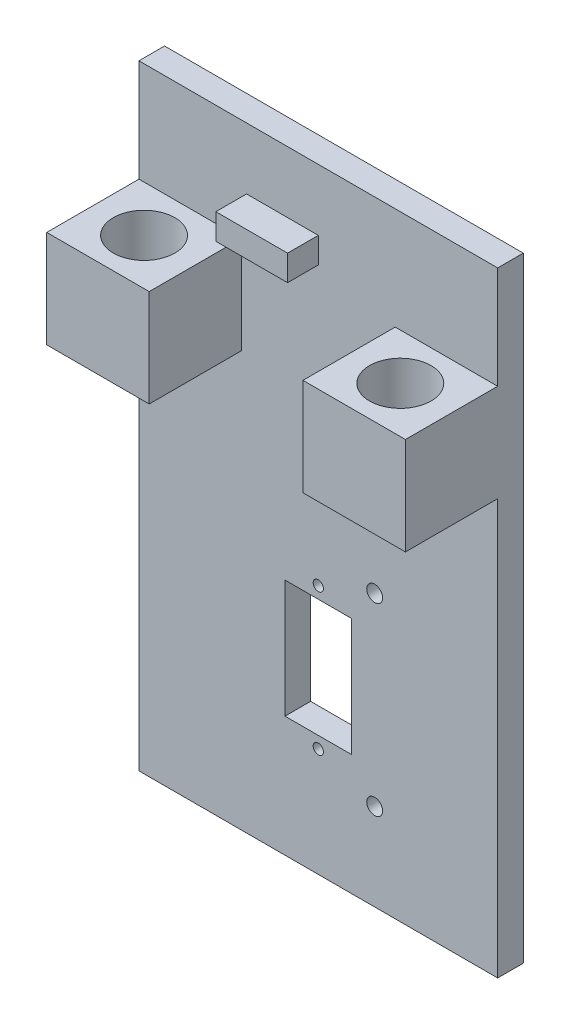
ISO-10303-21;
HEADER;
FILE_DESCRIPTION(('STEP AP214'),'2;1');
FILE_NAME('part.step','',(''),(''),'','','');
FILE_SCHEMA(('AUTOMOTIVE_DESIGN { 1 0 10303 214 1 1 1 1 }'));
ENDSEC;
DATA;
#1=APPLICATION_CONTEXT('core data for automotive mechanical design processes');
#2=APPLICATION_PROTOCOL_DEFINITION('international standard','automotive_design',2000,#1);
#3=PRODUCT_CONTEXT('',#1,'mechanical');
#4=PRODUCT('Part','Part','',(#3));
#5=PRODUCT_RELATED_PRODUCT_CATEGORY('part','',(#4));
#6=PRODUCT_DEFINITION_FORMATION('','',#4);
#7=PRODUCT_DEFINITION_CONTEXT('part definition',#1,'design');
#8=PRODUCT_DEFINITION('design','',#6,#7);
#9=PRODUCT_DEFINITION_SHAPE('','',#8);
#10=(LENGTH_UNIT() NAMED_UNIT(*) SI_UNIT(.MILLI.,.METRE.));
#11=(NAMED_UNIT(*) PLANE_ANGLE_UNIT() SI_UNIT($,.RADIAN.));
#12=(NAMED_UNIT(*) SI_UNIT($,.STERADIAN.) SOLID_ANGLE_UNIT());
#13=UNCERTAINTY_MEASURE_WITH_UNIT(LENGTH_MEASURE(1.E-05),#10,'distance_accuracy_value','');
#14=(GEOMETRIC_REPRESENTATION_CONTEXT(3) GLOBAL_UNCERTAINTY_ASSIGNED_CONTEXT((#13)) GLOBAL_UNIT_ASSIGNED_CONTEXT((#10,
#11,#12)) REPRESENTATION_CONTEXT('',''));
#15=CARTESIAN_POINT('',(0.,0.,0.));
#16=DIRECTION('',(0.,0.,1.));
#17=DIRECTION('',(1.,0.,0.));
#18=AXIS2_PLACEMENT_3D('',#15,#16,#17);
#19=CARTESIAN_POINT('',(0.,0.,5.));
#20=DIRECTION('',(0.,0.,-1.));
#21=DIRECTION('',(-1.,0.,0.));
#22=AXIS2_PLACEMENT_3D('',#19,#20,#21);
#23=PLANE('',#22);
#24=CARTESIAN_POINT('',(11.,-6.99999999999999,5.));
#25=DIRECTION('',(0.,0.,-1.));
#26=DIRECTION('',(-1.,0.,0.));
#27=AXIS2_PLACEMENT_3D('',#24,#25,#26);
#28=CIRCLE('',#27,1.55);
#29=CARTESIAN_POINT('',(9.45000000000002,-6.99999999999999,5.));
#30=VERTEX_POINT('',#29);
#31=EDGE_CURVE('E694',#30,#30,#28,.T.);
#32=ORIENTED_EDGE('',*,*,#31,.T.);
#33=EDGE_LOOP('',(#32));
#34=FACE_BOUND('',#33,.T.);
#35=CARTESIAN_POINT('',(11.,-43.,5.));
#36=DIRECTION('',(0.,0.,-1.));
#37=DIRECTION('',(-1.,0.,0.));
#38=AXIS2_PLACEMENT_3D('',#35,#36,#37);
#39=CIRCLE('',#38,1.55);
#40=CARTESIAN_POINT('',(9.45000000000001,-43.,5.));
#41=VERTEX_POINT('',#40);
#42=EDGE_CURVE('E696',#41,#41,#39,.T.);
#43=ORIENTED_EDGE('',*,*,#42,.T.);
#44=EDGE_LOOP('',(#43));
#45=FACE_BOUND('',#44,.T.);
#46=DIRECTION('',(-1.,0.,0.));
#47=VECTOR('',#46,1.);
#48=CARTESIAN_POINT('',(35.,40.,5.));
#49=LINE('',#48,#47);
#50=CARTESIAN_POINT('',(35.,40.,5.));
#51=VERTEX_POINT('',#50);
#52=CARTESIAN_POINT('',(15.,40.,5.));
#53=VERTEX_POINT('',#52);
#54=EDGE_CURVE('E285',#51,#53,#49,.T.);
#55=ORIENTED_EDGE('',*,*,#54,.F.);
#56=DIRECTION('',(0.,1.,0.));
#57=VECTOR('',#56,1.);
#58=CARTESIAN_POINT('',(35.,-60.,5.));
#59=LINE('',#58,#57);
#60=CARTESIAN_POINT('',(35.,60.,5.));
#61=VERTEX_POINT('',#60);
#62=EDGE_CURVE('E372',#51,#61,#59,.T.);
#63=ORIENTED_EDGE('',*,*,#62,.T.);
#64=DIRECTION('',(-1.,0.,0.));
#65=VECTOR('',#64,1.);
#66=CARTESIAN_POINT('',(-35.,60.,5.));
#67=LINE('',#66,#65);
#68=CARTESIAN_POINT('',(-35.,60.,5.));
#69=VERTEX_POINT('',#68);
#70=EDGE_CURVE('E371',#61,#69,#67,.T.);
#71=ORIENTED_EDGE('',*,*,#70,.T.);
#72=DIRECTION('',(0.,-1.,0.));
#73=VECTOR('',#72,1.);
#74=CARTESIAN_POINT('',(-35.,-60.,5.));
#75=LINE('',#74,#73);
#76=CARTESIAN_POINT('',(-35.,40.,5.));
#77=VERTEX_POINT('',#76);
#78=EDGE_CURVE('E376',#69,#77,#75,.T.);
#79=ORIENTED_EDGE('',*,*,#78,.T.);
#80=DIRECTION('',(-1.,0.,0.));
#81=VECTOR('',#80,1.);
#82=CARTESIAN_POINT('',(-35.,40.,5.));
#83=LINE('',#82,#81);
#84=CARTESIAN_POINT('',(-15.,40.,5.));
#85=VERTEX_POINT('',#84);
#86=EDGE_CURVE('E332',#85,#77,#83,.T.);
#87=ORIENTED_EDGE('',*,*,#86,.F.);
#88=DIRECTION('',(0.,1.,0.));
#89=VECTOR('',#88,1.);
#90=CARTESIAN_POINT('',(-15.,40.,5.));
#91=LINE('',#90,#89);
#92=CARTESIAN_POINT('',(-15.,21.,5.));
#93=VERTEX_POINT('',#92);
#94=EDGE_CURVE('E345',#93,#85,#91,.T.);
#95=ORIENTED_EDGE('',*,*,#94,.F.);
#96=DIRECTION('',(1.,0.,0.));
#97=VECTOR('',#96,1.);
#98=CARTESIAN_POINT('',(-35.,21.,5.));
#99=LINE('',#98,#97);
#100=CARTESIAN_POINT('',(-35.,21.,5.));
#101=VERTEX_POINT('',#100);
#102=EDGE_CURVE('E326',#101,#93,#99,.T.);
#103=ORIENTED_EDGE('',*,*,#102,.F.);
#104=CARTESIAN_POINT('',(-35.,-60.,5.));
#105=VERTEX_POINT('',#104);
#106=EDGE_CURVE('E375',#101,#105,#75,.T.);
#107=ORIENTED_EDGE('',*,*,#106,.T.);
#108=DIRECTION('',(1.,0.,0.));
#109=VECTOR('',#108,1.);
#110=CARTESIAN_POINT('',(-35.,-60.,5.));
#111=LINE('',#110,#109);
#112=CARTESIAN_POINT('',(35.,-60.,5.));
#113=VERTEX_POINT('',#112);
#114=EDGE_CURVE('E379',#105,#113,#111,.T.);
#115=ORIENTED_EDGE('',*,*,#114,.T.);
#116=CARTESIAN_POINT('',(35.,21.,5.));
#117=VERTEX_POINT('',#116);
#118=EDGE_CURVE('E368',#113,#117,#59,.T.);
#119=ORIENTED_EDGE('',*,*,#118,.T.);
#120=DIRECTION('',(1.,0.,0.));
#121=VECTOR('',#120,1.);
#122=CARTESIAN_POINT('',(35.,21.,5.));
#123=LINE('',#122,#121);
#124=CARTESIAN_POINT('',(15.,21.,5.));
#125=VERTEX_POINT('',#124);
#126=EDGE_CURVE('E291',#125,#117,#123,.T.);
#127=ORIENTED_EDGE('',*,*,#126,.F.);
#128=DIRECTION('',(0.,-1.,0.));
#129=VECTOR('',#128,1.);
#130=CARTESIAN_POINT('',(15.,40.,5.));
#131=LINE('',#130,#129);
#132=EDGE_CURVE('E304',#53,#125,#131,.T.);
#133=ORIENTED_EDGE('',*,*,#132,.F.);
#134=EDGE_LOOP('',(#55,#63,#71,#79,#87,#95,#103,#107,#115,#119,#127,#133));
#135=FACE_BOUND('',#134,.T.);
#136=DIRECTION('',(1.,0.,0.));
#137=VECTOR('',#136,1.);
#138=CARTESIAN_POINT('',(6.50000000000001,-36.5,5.));
#139=LINE('',#138,#137);
#140=CARTESIAN_POINT('',(-6.49999999999999,-36.5,5.));
#141=VERTEX_POINT('',#140);
#142=CARTESIAN_POINT('',(6.50000000000001,-36.5,5.));
#143=VERTEX_POINT('',#142);
#144=EDGE_CURVE('E233',#141,#143,#139,.T.);
#145=ORIENTED_EDGE('',*,*,#144,.F.);
#146=DIRECTION('',(0.,-1.,0.));
#147=VECTOR('',#146,1.);
#148=CARTESIAN_POINT('',(-6.49999999999999,-36.5,5.));
#149=LINE('',#148,#147);
#150=CARTESIAN_POINT('',(-6.49999999999999,-13.5,5.));
#151=VERTEX_POINT('',#150);
#152=EDGE_CURVE('E237',#151,#141,#149,.T.);
#153=ORIENTED_EDGE('',*,*,#152,.F.);
#154=DIRECTION('',(-1.,0.,0.));
#155=VECTOR('',#154,1.);
#156=CARTESIAN_POINT('',(6.50000000000001,-13.5,5.));
#157=LINE('',#156,#155);
#158=CARTESIAN_POINT('',(6.50000000000001,-13.5,5.));
#159=VERTEX_POINT('',#158);
#160=EDGE_CURVE('E260',#159,#151,#157,.T.);
#161=ORIENTED_EDGE('',*,*,#160,.F.);
#162=DIRECTION('',(0.,1.,0.));
#163=VECTOR('',#162,1.);
#164=CARTESIAN_POINT('',(6.50000000000001,-36.5,5.));
#165=LINE('',#164,#163);
#166=EDGE_CURVE('E226',#143,#159,#165,.T.);
#167=ORIENTED_EDGE('',*,*,#166,.F.);
#168=EDGE_LOOP('',(#145,#153,#161,#167));
#169=FACE_BOUND('',#168,.T.);
#170=CARTESIAN_POINT('',(0.,-11.2,5.));
#171=DIRECTION('',(0.,0.,-1.));
#172=DIRECTION('',(-1.,0.,0.));
#173=AXIS2_PLACEMENT_3D('',#170,#171,#172);
#174=CIRCLE('',#173,1.);
#175=CARTESIAN_POINT('',(-0.999999999999986,-11.2,5.));
#176=VERTEX_POINT('',#175);
#177=EDGE_CURVE('E223',#176,#176,#174,.F.);
#178=ORIENTED_EDGE('',*,*,#177,.F.);
#179=EDGE_LOOP('',(#178));
#180=FACE_BOUND('',#179,.T.);
#181=CARTESIAN_POINT('',(0.,-38.8,5.));
#182=DIRECTION('',(0.,0.,-1.));
#183=DIRECTION('',(-1.,0.,0.));
#184=AXIS2_PLACEMENT_3D('',#181,#182,#183);
#185=CIRCLE('',#184,1.);
#186=CARTESIAN_POINT('',(-0.999999999999987,-38.8,5.));
#187=VERTEX_POINT('',#186);
#188=EDGE_CURVE('E213',#187,#187,#185,.F.);
#189=ORIENTED_EDGE('',*,*,#188,.F.);
#190=EDGE_LOOP('',(#189));
#191=FACE_BOUND('',#190,.T.);
#192=DIRECTION('',(0.,1.,0.));
#193=VECTOR('',#192,1.);
#194=CARTESIAN_POINT('',(0.,48.,5.));
#195=LINE('',#194,#193);
#196=CARTESIAN_POINT('',(0.,43.,5.));
#197=VERTEX_POINT('',#196);
#198=CARTESIAN_POINT('',(0.,48.,5.));
#199=VERTEX_POINT('',#198);
#200=EDGE_CURVE('E206',#197,#199,#195,.T.);
#201=ORIENTED_EDGE('',*,*,#200,.F.);
#202=DIRECTION('',(1.,0.,0.));
#203=VECTOR('',#202,1.);
#204=CARTESIAN_POINT('',(-14.,43.,5.));
#205=LINE('',#204,#203);
#206=CARTESIAN_POINT('',(-14.,43.,5.));
#207=VERTEX_POINT('',#206);
#208=EDGE_CURVE('E203',#207,#197,#205,.T.);
#209=ORIENTED_EDGE('',*,*,#208,.F.);
#210=DIRECTION('',(0.,-1.,0.));
#211=VECTOR('',#210,1.);
#212=CARTESIAN_POINT('',(-14.,48.,5.));
#213=LINE('',#212,#211);
#214=CARTESIAN_POINT('',(-14.,48.,5.));
#215=VERTEX_POINT('',#214);
#216=EDGE_CURVE('E67',#215,#207,#213,.T.);
#217=ORIENTED_EDGE('',*,*,#216,.F.);
#218=DIRECTION('',(-1.,0.,0.));
#219=VECTOR('',#218,1.);
#220=CARTESIAN_POINT('',(-14.,48.,5.));
#221=LINE('',#220,#219);
#222=EDGE_CURVE('E62',#199,#215,#221,.T.);
#223=ORIENTED_EDGE('',*,*,#222,.F.);
#224=EDGE_LOOP('',(#201,#209,#217,#223));
#225=FACE_BOUND('',#224,.T.);
#226=ADVANCED_FACE('F45',(#34,#45,#135,#169,#180,#191,#225),#23,.F.);
#227=CARTESIAN_POINT('',(35.,-60.,5.));
#228=DIRECTION('',(-1.,0.,0.));
#229=DIRECTION('',(0.,0.,1.));
#230=AXIS2_PLACEMENT_3D('',#227,#228,#229);
#231=PLANE('',#230);
#232=DIRECTION('',(0.,1.,0.));
#233=VECTOR('',#232,1.);
#234=CARTESIAN_POINT('',(35.,-60.,0.));
#235=LINE('',#234,#233);
#236=CARTESIAN_POINT('',(35.,-60.,0.));
#237=VERTEX_POINT('',#236);
#238=CARTESIAN_POINT('',(35.,60.,0.));
#239=VERTEX_POINT('',#238);
#240=EDGE_CURVE('E367',#237,#239,#235,.T.);
#241=ORIENTED_EDGE('',*,*,#240,.T.);
#242=DIRECTION('',(0.,0.,-1.));
#243=VECTOR('',#242,1.);
#244=CARTESIAN_POINT('',(35.,60.,5.));
#245=LINE('',#244,#243);
#246=EDGE_CURVE('E11',#61,#239,#245,.T.);
#247=ORIENTED_EDGE('',*,*,#246,.F.);
#248=ORIENTED_EDGE('',*,*,#62,.F.);
#249=DIRECTION('',(0.,0.,-1.));
#250=VECTOR('',#249,1.);
#251=CARTESIAN_POINT('',(35.,40.,23.));
#252=LINE('',#251,#250);
#253=CARTESIAN_POINT('',(35.,40.,23.));
#254=VERTEX_POINT('',#253);
#255=EDGE_CURVE('E322',#254,#51,#252,.T.);
#256=ORIENTED_EDGE('',*,*,#255,.F.);
#257=DIRECTION('',(0.,1.,0.));
#258=VECTOR('',#257,1.);
#259=CARTESIAN_POINT('',(35.,40.,23.));
#260=LINE('',#259,#258);
#261=CARTESIAN_POINT('',(35.,21.,23.));
#262=VERTEX_POINT('',#261);
#263=EDGE_CURVE('E286',#262,#254,#260,.T.);
#264=ORIENTED_EDGE('',*,*,#263,.F.);
#265=DIRECTION('',(0.,0.,-1.));
#266=VECTOR('',#265,1.);
#267=CARTESIAN_POINT('',(35.,21.,23.));
#268=LINE('',#267,#266);
#269=EDGE_CURVE('E300',#262,#117,#268,.T.);
#270=ORIENTED_EDGE('',*,*,#269,.T.);
#271=ORIENTED_EDGE('',*,*,#118,.F.);
#272=DIRECTION('',(0.,0.,-1.));
#273=VECTOR('',#272,1.);
#274=CARTESIAN_POINT('',(35.,-60.,5.));
#275=LINE('',#274,#273);
#276=EDGE_CURVE('E382',#113,#237,#275,.T.);
#277=ORIENTED_EDGE('',*,*,#276,.T.);
#278=EDGE_LOOP('',(#241,#247,#248,#256,#264,#270,#271,#277));
#279=FACE_BOUND('',#278,.T.);
#280=ADVANCED_FACE('F47',(#279),#231,.F.);
#281=CARTESIAN_POINT('',(-35.,60.,5.));
#282=DIRECTION('',(0.,-1.,0.));
#283=DIRECTION('',(0.,0.,-1.));
#284=AXIS2_PLACEMENT_3D('',#281,#282,#283);
#285=PLANE('',#284);
#286=DIRECTION('',(-1.,0.,0.));
#287=VECTOR('',#286,1.);
#288=CARTESIAN_POINT('',(-35.,60.,0.));
#289=LINE('',#288,#287);
#290=CARTESIAN_POINT('',(-35.,60.,0.));
#291=VERTEX_POINT('',#290);
#292=EDGE_CURVE('E386',#239,#291,#289,.T.);
#293=ORIENTED_EDGE('',*,*,#292,.T.);
#294=DIRECTION('',(0.,0.,-1.));
#295=VECTOR('',#294,1.);
#296=CARTESIAN_POINT('',(-35.,60.,5.));
#297=LINE('',#296,#295);
#298=EDGE_CURVE('E55',#69,#291,#297,.T.);
#299=ORIENTED_EDGE('',*,*,#298,.F.);
#300=ORIENTED_EDGE('',*,*,#70,.F.);
#301=ORIENTED_EDGE('',*,*,#246,.T.);
#302=EDGE_LOOP('',(#293,#299,#300,#301));
#303=FACE_BOUND('',#302,.T.);
#304=ADVANCED_FACE('F469',(#303),#285,.F.);
#305=CARTESIAN_POINT('',(-35.,-60.,5.));
#306=DIRECTION('',(1.,0.,0.));
#307=DIRECTION('',(0.,0.,-1.));
#308=AXIS2_PLACEMENT_3D('',#305,#306,#307);
#309=PLANE('',#308);
#310=DIRECTION('',(0.,-1.,0.));
#311=VECTOR('',#310,1.);
#312=CARTESIAN_POINT('',(-35.,-60.,0.));
#313=LINE('',#312,#311);
#314=CARTESIAN_POINT('',(-35.,-60.,0.));
#315=VERTEX_POINT('',#314);
#316=EDGE_CURVE('E389',#291,#315,#313,.T.);
#317=ORIENTED_EDGE('',*,*,#316,.T.);
#318=DIRECTION('',(0.,0.,-1.));
#319=VECTOR('',#318,1.);
#320=CARTESIAN_POINT('',(-35.,-60.,5.));
#321=LINE('',#320,#319);
#322=EDGE_CURVE('E398',#105,#315,#321,.T.);
#323=ORIENTED_EDGE('',*,*,#322,.F.);
#324=ORIENTED_EDGE('',*,*,#106,.F.);
#325=DIRECTION('',(0.,0.,-1.));
#326=VECTOR('',#325,1.);
#327=CARTESIAN_POINT('',(-35.,21.,23.));
#328=LINE('',#327,#326);
#329=CARTESIAN_POINT('',(-35.,21.,23.));
#330=VERTEX_POINT('',#329);
#331=EDGE_CURVE('E363',#330,#101,#328,.T.);
#332=ORIENTED_EDGE('',*,*,#331,.F.);
#333=DIRECTION('',(0.,-1.,0.));
#334=VECTOR('',#333,1.);
#335=CARTESIAN_POINT('',(-35.,40.,23.));
#336=LINE('',#335,#334);
#337=CARTESIAN_POINT('',(-35.,40.,23.));
#338=VERTEX_POINT('',#337);
#339=EDGE_CURVE('E327',#338,#330,#336,.T.);
#340=ORIENTED_EDGE('',*,*,#339,.F.);
#341=DIRECTION('',(0.,0.,-1.));
#342=VECTOR('',#341,1.);
#343=CARTESIAN_POINT('',(-35.,40.,23.));
#344=LINE('',#343,#342);
#345=EDGE_CURVE('E341',#338,#77,#344,.T.);
#346=ORIENTED_EDGE('',*,*,#345,.T.);
#347=ORIENTED_EDGE('',*,*,#78,.F.);
#348=ORIENTED_EDGE('',*,*,#298,.T.);
#349=EDGE_LOOP('',(#317,#323,#324,#332,#340,#346,#347,#348));
#350=FACE_BOUND('',#349,.T.);
#351=ADVANCED_FACE('F408',(#350),#309,.F.);
#352=CARTESIAN_POINT('',(-35.,-60.,5.));
#353=DIRECTION('',(0.,1.,0.));
#354=DIRECTION('',(-1.,0.,0.));
#355=AXIS2_PLACEMENT_3D('',#352,#353,#354);
#356=PLANE('',#355);
#357=DIRECTION('',(1.,0.,0.));
#358=VECTOR('',#357,1.);
#359=CARTESIAN_POINT('',(-35.,-60.,0.));
#360=LINE('',#359,#358);
#361=EDGE_CURVE('E392',#315,#237,#360,.T.);
#362=ORIENTED_EDGE('',*,*,#361,.T.);
#363=ORIENTED_EDGE('',*,*,#276,.F.);
#364=ORIENTED_EDGE('',*,*,#114,.F.);
#365=ORIENTED_EDGE('',*,*,#322,.T.);
#366=EDGE_LOOP('',(#362,#363,#364,#365));
#367=FACE_BOUND('',#366,.T.);
#368=ADVANCED_FACE('F418',(#367),#356,.F.);
#369=CARTESIAN_POINT('',(0.,0.,0.));
#370=DIRECTION('',(0.,0.,-1.));
#371=DIRECTION('',(-1.,0.,0.));
#372=AXIS2_PLACEMENT_3D('',#369,#370,#371);
#373=PLANE('',#372);
#374=CARTESIAN_POINT('',(11.,-6.99999999999999,0.));
#375=DIRECTION('',(0.,0.,-1.));
#376=DIRECTION('',(-1.,0.,0.));
#377=AXIS2_PLACEMENT_3D('',#374,#375,#376);
#378=CIRCLE('',#377,1.55);
#379=CARTESIAN_POINT('',(9.45000000000002,-6.99999999999999,0.));
#380=VERTEX_POINT('',#379);
#381=EDGE_CURVE('E692',#380,#380,#378,.T.);
#382=ORIENTED_EDGE('',*,*,#381,.F.);
#383=EDGE_LOOP('',(#382));
#384=FACE_BOUND('',#383,.T.);
#385=CARTESIAN_POINT('',(11.,-43.,0.));
#386=DIRECTION('',(0.,0.,-1.));
#387=DIRECTION('',(-1.,0.,0.));
#388=AXIS2_PLACEMENT_3D('',#385,#386,#387);
#389=CIRCLE('',#388,1.55);
#390=CARTESIAN_POINT('',(9.45000000000001,-43.,0.));
#391=VERTEX_POINT('',#390);
#392=EDGE_CURVE('E721',#391,#391,#389,.T.);
#393=ORIENTED_EDGE('',*,*,#392,.F.);
#394=EDGE_LOOP('',(#393));
#395=FACE_BOUND('',#394,.T.);
#396=CARTESIAN_POINT('',(0.,-38.8,0.));
#397=DIRECTION('',(0.,0.,-1.));
#398=DIRECTION('',(-1.,0.,0.));
#399=AXIS2_PLACEMENT_3D('',#396,#397,#398);
#400=CIRCLE('',#399,1.);
#401=CARTESIAN_POINT('',(-0.999999999999987,-38.8,0.));
#402=VERTEX_POINT('',#401);
#403=EDGE_CURVE('E208',#402,#402,#400,.T.);
#404=ORIENTED_EDGE('',*,*,#403,.F.);
#405=EDGE_LOOP('',(#404));
#406=FACE_BOUND('',#405,.T.);
#407=CARTESIAN_POINT('',(0.,-11.2,0.));
#408=DIRECTION('',(0.,0.,-1.));
#409=DIRECTION('',(-1.,0.,0.));
#410=AXIS2_PLACEMENT_3D('',#407,#408,#409);
#411=CIRCLE('',#410,1.);
#412=CARTESIAN_POINT('',(-0.999999999999986,-11.2,0.));
#413=VERTEX_POINT('',#412);
#414=EDGE_CURVE('E219',#413,#413,#411,.T.);
#415=ORIENTED_EDGE('',*,*,#414,.F.);
#416=EDGE_LOOP('',(#415));
#417=FACE_BOUND('',#416,.T.);
#418=DIRECTION('',(0.,1.,0.));
#419=VECTOR('',#418,1.);
#420=CARTESIAN_POINT('',(-6.49999999999999,-36.5,0.));
#421=LINE('',#420,#419);
#422=CARTESIAN_POINT('',(-6.49999999999999,-36.5,0.));
#423=VERTEX_POINT('',#422);
#424=CARTESIAN_POINT('',(-6.49999999999999,-13.5,0.));
#425=VERTEX_POINT('',#424);
#426=EDGE_CURVE('E241',#423,#425,#421,.T.);
#427=ORIENTED_EDGE('',*,*,#426,.F.);
#428=DIRECTION('',(-1.,0.,0.));
#429=VECTOR('',#428,1.);
#430=CARTESIAN_POINT('',(6.50000000000001,-36.5,0.));
#431=LINE('',#430,#429);
#432=CARTESIAN_POINT('',(6.50000000000001,-36.5,0.));
#433=VERTEX_POINT('',#432);
#434=EDGE_CURVE('E252',#433,#423,#431,.T.);
#435=ORIENTED_EDGE('',*,*,#434,.F.);
#436=DIRECTION('',(0.,-1.,0.));
#437=VECTOR('',#436,1.);
#438=CARTESIAN_POINT('',(6.50000000000001,-36.5,0.));
#439=LINE('',#438,#437);
#440=CARTESIAN_POINT('',(6.50000000000001,-13.5,0.));
#441=VERTEX_POINT('',#440);
#442=EDGE_CURVE('E248',#441,#433,#439,.T.);
#443=ORIENTED_EDGE('',*,*,#442,.F.);
#444=DIRECTION('',(1.,0.,0.));
#445=VECTOR('',#444,1.);
#446=CARTESIAN_POINT('',(6.50000000000001,-13.5,0.));
#447=LINE('',#446,#445);
#448=EDGE_CURVE('E244',#425,#441,#447,.T.);
#449=ORIENTED_EDGE('',*,*,#448,.F.);
#450=EDGE_LOOP('',(#427,#435,#443,#449));
#451=FACE_BOUND('',#450,.T.);
#452=ORIENTED_EDGE('',*,*,#240,.F.);
#453=ORIENTED_EDGE('',*,*,#361,.F.);
#454=ORIENTED_EDGE('',*,*,#316,.F.);
#455=ORIENTED_EDGE('',*,*,#292,.F.);
#456=EDGE_LOOP('',(#452,#453,#454,#455));
#457=FACE_BOUND('',#456,.T.);
#458=ADVANCED_FACE('F415',(#384,#395,#406,#417,#451,#457),#373,.T.);
#459=CARTESIAN_POINT('',(-35.,21.,23.));
#460=DIRECTION('',(0.,1.,0.));
#461=DIRECTION('',(0.,0.,1.));
#462=AXIS2_PLACEMENT_3D('',#459,#460,#461);
#463=PLANE('',#462);
#464=CARTESIAN_POINT('',(-25.,21.,14.));
#465=DIRECTION('',(0.,1.,0.));
#466=DIRECTION('',(0.,0.,1.));
#467=AXIS2_PLACEMENT_3D('',#464,#465,#466);
#468=CIRCLE('',#467,6.);
#469=CARTESIAN_POINT('',(-31.,21.,14.));
#470=VERTEX_POINT('',#469);
#471=EDGE_CURVE('E281',#470,#470,#468,.T.);
#472=ORIENTED_EDGE('',*,*,#471,.T.);
#473=EDGE_LOOP('',(#472));
#474=FACE_BOUND('',#473,.T.);
#475=ORIENTED_EDGE('',*,*,#102,.T.);
#476=DIRECTION('',(0.,0.,-1.));
#477=VECTOR('',#476,1.);
#478=CARTESIAN_POINT('',(-15.,21.,23.));
#479=LINE('',#478,#477);
#480=CARTESIAN_POINT('',(-15.,21.,23.));
#481=VERTEX_POINT('',#480);
#482=EDGE_CURVE('E359',#481,#93,#479,.T.);
#483=ORIENTED_EDGE('',*,*,#482,.F.);
#484=DIRECTION('',(1.,0.,0.));
#485=VECTOR('',#484,1.);
#486=CARTESIAN_POINT('',(-35.,21.,23.));
#487=LINE('',#486,#485);
#488=EDGE_CURVE('E331',#330,#481,#487,.T.);
#489=ORIENTED_EDGE('',*,*,#488,.F.);
#490=ORIENTED_EDGE('',*,*,#331,.T.);
#491=EDGE_LOOP('',(#475,#483,#489,#490));
#492=FACE_BOUND('',#491,.T.);
#493=ADVANCED_FACE('F474',(#474,#492),#463,.F.);
#494=CARTESIAN_POINT('',(-15.,40.,23.));
#495=DIRECTION('',(-1.,0.,0.));
#496=DIRECTION('',(0.,-1.,0.));
#497=AXIS2_PLACEMENT_3D('',#494,#495,#496);
#498=PLANE('',#497);
#499=ORIENTED_EDGE('',*,*,#94,.T.);
#500=DIRECTION('',(0.,0.,-1.));
#501=VECTOR('',#500,1.);
#502=CARTESIAN_POINT('',(-15.,40.,23.));
#503=LINE('',#502,#501);
#504=CARTESIAN_POINT('',(-15.,40.,23.));
#505=VERTEX_POINT('',#504);
#506=EDGE_CURVE('E355',#505,#85,#503,.T.);
#507=ORIENTED_EDGE('',*,*,#506,.F.);
#508=DIRECTION('',(0.,1.,0.));
#509=VECTOR('',#508,1.);
#510=CARTESIAN_POINT('',(-15.,40.,23.));
#511=LINE('',#510,#509);
#512=EDGE_CURVE('E335',#481,#505,#511,.T.);
#513=ORIENTED_EDGE('',*,*,#512,.F.);
#514=ORIENTED_EDGE('',*,*,#482,.T.);
#515=EDGE_LOOP('',(#499,#507,#513,#514));
#516=FACE_BOUND('',#515,.T.);
#517=ADVANCED_FACE('F497',(#516),#498,.F.);
#518=CARTESIAN_POINT('',(-35.,40.,23.));
#519=DIRECTION('',(0.,-1.,0.));
#520=DIRECTION('',(1.,0.,0.));
#521=AXIS2_PLACEMENT_3D('',#518,#519,#520);
#522=PLANE('',#521);
#523=CARTESIAN_POINT('',(-25.,40.,14.));
#524=DIRECTION('',(0.,1.,0.));
#525=DIRECTION('',(-1.,0.,0.));
#526=AXIS2_PLACEMENT_3D('',#523,#524,#525);
#527=CIRCLE('',#526,6.);
#528=CARTESIAN_POINT('',(-31.,40.,14.));
#529=VERTEX_POINT('',#528);
#530=EDGE_CURVE('E274',#529,#529,#527,.T.);
#531=ORIENTED_EDGE('',*,*,#530,.F.);
#532=EDGE_LOOP('',(#531));
#533=FACE_BOUND('',#532,.T.);
#534=ORIENTED_EDGE('',*,*,#86,.T.);
#535=ORIENTED_EDGE('',*,*,#345,.F.);
#536=DIRECTION('',(-1.,0.,0.));
#537=VECTOR('',#536,1.);
#538=CARTESIAN_POINT('',(-35.,40.,23.));
#539=LINE('',#538,#537);
#540=EDGE_CURVE('E338',#505,#338,#539,.T.);
#541=ORIENTED_EDGE('',*,*,#540,.F.);
#542=ORIENTED_EDGE('',*,*,#506,.T.);
#543=EDGE_LOOP('',(#534,#535,#541,#542));
#544=FACE_BOUND('',#543,.T.);
#545=ADVANCED_FACE('F486',(#533,#544),#522,.F.);
#546=CARTESIAN_POINT('',(0.,0.,23.));
#547=DIRECTION('',(0.,0.,1.));
#548=DIRECTION('',(1.,0.,0.));
#549=AXIS2_PLACEMENT_3D('',#546,#547,#548);
#550=PLANE('',#549);
#551=ORIENTED_EDGE('',*,*,#339,.T.);
#552=ORIENTED_EDGE('',*,*,#488,.T.);
#553=ORIENTED_EDGE('',*,*,#512,.T.);
#554=ORIENTED_EDGE('',*,*,#540,.T.);
#555=EDGE_LOOP('',(#551,#552,#553,#554));
#556=FACE_BOUND('',#555,.T.);
#557=ADVANCED_FACE('F493',(#556),#550,.T.);
#558=CARTESIAN_POINT('',(35.,40.,23.));
#559=DIRECTION('',(0.,-1.,0.));
#560=DIRECTION('',(0.,0.,-1.));
#561=AXIS2_PLACEMENT_3D('',#558,#559,#560);
#562=PLANE('',#561);
#563=CARTESIAN_POINT('',(25.,40.,14.));
#564=DIRECTION('',(0.,1.,0.));
#565=DIRECTION('',(-1.,0.,0.));
#566=AXIS2_PLACEMENT_3D('',#563,#564,#565);
#567=CIRCLE('',#566,5.99999999999999);
#568=CARTESIAN_POINT('',(19.0000000000001,40.,14.));
#569=VERTEX_POINT('',#568);
#570=EDGE_CURVE('E273',#569,#569,#567,.T.);
#571=ORIENTED_EDGE('',*,*,#570,.F.);
#572=EDGE_LOOP('',(#571));
#573=FACE_BOUND('',#572,.T.);
#574=ORIENTED_EDGE('',*,*,#54,.T.);
#575=DIRECTION('',(0.,0.,-1.));
#576=VECTOR('',#575,1.);
#577=CARTESIAN_POINT('',(15.,40.,23.));
#578=LINE('',#577,#576);
#579=CARTESIAN_POINT('',(15.,40.,23.));
#580=VERTEX_POINT('',#579);
#581=EDGE_CURVE('E318',#580,#53,#578,.T.);
#582=ORIENTED_EDGE('',*,*,#581,.F.);
#583=DIRECTION('',(-1.,0.,0.));
#584=VECTOR('',#583,1.);
#585=CARTESIAN_POINT('',(35.,40.,23.));
#586=LINE('',#585,#584);
#587=EDGE_CURVE('E290',#254,#580,#586,.T.);
#588=ORIENTED_EDGE('',*,*,#587,.F.);
#589=ORIENTED_EDGE('',*,*,#255,.T.);
#590=EDGE_LOOP('',(#574,#582,#588,#589));
#591=FACE_BOUND('',#590,.T.);
#592=ADVANCED_FACE('F437',(#573,#591),#562,.F.);
#593=CARTESIAN_POINT('',(15.,40.,23.));
#594=DIRECTION('',(1.,0.,0.));
#595=DIRECTION('',(0.,1.,0.));
#596=AXIS2_PLACEMENT_3D('',#593,#594,#595);
#597=PLANE('',#596);
#598=ORIENTED_EDGE('',*,*,#132,.T.);
#599=DIRECTION('',(0.,0.,-1.));
#600=VECTOR('',#599,1.);
#601=CARTESIAN_POINT('',(15.,21.,23.));
#602=LINE('',#601,#600);
#603=CARTESIAN_POINT('',(15.,21.,23.));
#604=VERTEX_POINT('',#603);
#605=EDGE_CURVE('E314',#604,#125,#602,.T.);
#606=ORIENTED_EDGE('',*,*,#605,.F.);
#607=DIRECTION('',(0.,-1.,0.));
#608=VECTOR('',#607,1.);
#609=CARTESIAN_POINT('',(15.,40.,23.));
#610=LINE('',#609,#608);
#611=EDGE_CURVE('E294',#580,#604,#610,.T.);
#612=ORIENTED_EDGE('',*,*,#611,.F.);
#613=ORIENTED_EDGE('',*,*,#581,.T.);
#614=EDGE_LOOP('',(#598,#606,#612,#613));
#615=FACE_BOUND('',#614,.T.);
#616=ADVANCED_FACE('F434',(#615),#597,.F.);
#617=CARTESIAN_POINT('',(35.,21.,23.));
#618=DIRECTION('',(0.,1.,0.));
#619=DIRECTION('',(-1.,0.,0.));
#620=AXIS2_PLACEMENT_3D('',#617,#618,#619);
#621=PLANE('',#620);
#622=CARTESIAN_POINT('',(25.,21.,14.));
#623=DIRECTION('',(0.,1.,0.));
#624=DIRECTION('',(-1.,0.,0.));
#625=AXIS2_PLACEMENT_3D('',#622,#623,#624);
#626=CIRCLE('',#625,5.99999999999999);
#627=CARTESIAN_POINT('',(19.,21.,14.));
#628=VERTEX_POINT('',#627);
#629=EDGE_CURVE('E49',#628,#628,#626,.T.);
#630=ORIENTED_EDGE('',*,*,#629,.T.);
#631=EDGE_LOOP('',(#630));
#632=FACE_BOUND('',#631,.T.);
#633=ORIENTED_EDGE('',*,*,#126,.T.);
#634=ORIENTED_EDGE('',*,*,#269,.F.);
#635=DIRECTION('',(1.,0.,0.));
#636=VECTOR('',#635,1.);
#637=CARTESIAN_POINT('',(35.,21.,23.));
#638=LINE('',#637,#636);
#639=EDGE_CURVE('E297',#604,#262,#638,.T.);
#640=ORIENTED_EDGE('',*,*,#639,.F.);
#641=ORIENTED_EDGE('',*,*,#605,.T.);
#642=EDGE_LOOP('',(#633,#634,#640,#641));
#643=FACE_BOUND('',#642,.T.);
#644=ADVANCED_FACE('F429',(#632,#643),#621,.F.);
#645=CARTESIAN_POINT('',(0.,0.,23.));
#646=DIRECTION('',(0.,0.,-1.));
#647=DIRECTION('',(-1.,0.,0.));
#648=AXIS2_PLACEMENT_3D('',#645,#646,#647);
#649=PLANE('',#648);
#650=ORIENTED_EDGE('',*,*,#263,.T.);
#651=ORIENTED_EDGE('',*,*,#587,.T.);
#652=ORIENTED_EDGE('',*,*,#611,.T.);
#653=ORIENTED_EDGE('',*,*,#639,.T.);
#654=EDGE_LOOP('',(#650,#651,#652,#653));
#655=FACE_BOUND('',#654,.T.);
#656=ADVANCED_FACE('F448',(#655),#649,.F.);
#657=CARTESIAN_POINT('',(25.,-60.,14.));
#658=DIRECTION('',(0.,1.,0.));
#659=DIRECTION('',(-1.,0.,0.));
#660=AXIS2_PLACEMENT_3D('',#657,#658,#659);
#661=CYLINDRICAL_SURFACE('',#660,5.99999999999999);
#662=CARTESIAN_POINT('',(19.0000000000001,40.,14.));
#663=CARTESIAN_POINT('',(19.0000000000001,39.8020833333333,14.));
#664=CARTESIAN_POINT('',(19.0000000000001,39.6041666666667,14.));
#665=CARTESIAN_POINT('',(19.0000000000001,39.2083333333333,14.));
#666=CARTESIAN_POINT('',(19.0000000000001,39.0104166666667,14.));
#667=CARTESIAN_POINT('',(19.0000000000001,38.6145833333333,14.));
#668=CARTESIAN_POINT('',(19.0000000000001,38.4166666666667,14.));
#669=CARTESIAN_POINT('',(19.0000000000001,38.0208333333333,14.));
#670=CARTESIAN_POINT('',(19.0000000000001,37.8229166666667,14.));
#671=CARTESIAN_POINT('',(19.0000000000001,37.4270833333333,14.));
#672=CARTESIAN_POINT('',(19.0000000000001,37.2291666666667,14.));
#673=CARTESIAN_POINT('',(19.0000000000001,36.8333333333333,14.));
#674=CARTESIAN_POINT('',(19.0000000000001,36.6354166666667,14.));
#675=CARTESIAN_POINT('',(19.0000000000001,36.2395833333333,14.));
#676=CARTESIAN_POINT('',(19.0000000000001,36.0416666666667,14.));
#677=CARTESIAN_POINT('',(19.0000000000001,35.6458333333333,14.));
#678=CARTESIAN_POINT('',(19.0000000000001,35.4479166666667,14.));
#679=CARTESIAN_POINT('',(19.0000000000001,35.0520833333333,14.));
#680=CARTESIAN_POINT('',(19.0000000000001,34.8541666666667,14.));
#681=CARTESIAN_POINT('',(19.0000000000001,34.4583333333333,14.));
#682=CARTESIAN_POINT('',(19.0000000000001,34.2604166666667,14.));
#683=CARTESIAN_POINT('',(19.0000000000001,33.8645833333333,14.));
#684=CARTESIAN_POINT('',(19.0000000000001,33.6666666666667,14.));
#685=CARTESIAN_POINT('',(19.0000000000001,33.2708333333333,14.));
#686=CARTESIAN_POINT('',(19.0000000000001,33.0729166666667,14.));
#687=CARTESIAN_POINT('',(19.0000000000001,32.6770833333333,14.));
#688=CARTESIAN_POINT('',(19.0000000000001,32.4791666666667,14.));
#689=CARTESIAN_POINT('',(19.0000000000001,32.0833333333333,14.));
#690=CARTESIAN_POINT('',(19.0000000000001,31.8854166666667,14.));
#691=CARTESIAN_POINT('',(19.0000000000001,31.4895833333333,14.));
#692=CARTESIAN_POINT('',(19.0000000000001,31.2916666666667,14.));
#693=CARTESIAN_POINT('',(19.0000000000001,30.8958333333333,14.));
#694=CARTESIAN_POINT('',(19.0000000000001,30.6979166666667,14.));
#695=CARTESIAN_POINT('',(19.0000000000001,30.3020833333333,14.));
#696=CARTESIAN_POINT('',(19.0000000000001,30.1041666666667,14.));
#697=CARTESIAN_POINT('',(19.0000000000001,29.7083333333333,14.));
#698=CARTESIAN_POINT('',(19.0000000000001,29.5104166666667,14.));
#699=CARTESIAN_POINT('',(19.0000000000001,29.1145833333333,14.));
#700=CARTESIAN_POINT('',(19.0000000000001,28.9166666666667,14.));
#701=CARTESIAN_POINT('',(19.0000000000001,28.5208333333333,14.));
#702=CARTESIAN_POINT('',(19.0000000000001,28.3229166666667,14.));
#703=CARTESIAN_POINT('',(19.0000000000001,27.9270833333333,14.));
#704=CARTESIAN_POINT('',(19.0000000000001,27.7291666666667,14.));
#705=CARTESIAN_POINT('',(19.0000000000001,27.3333333333333,14.));
#706=CARTESIAN_POINT('',(19.0000000000001,27.1354166666667,14.));
#707=CARTESIAN_POINT('',(19.0000000000001,26.7395833333333,14.));
#708=CARTESIAN_POINT('',(19.0000000000001,26.5416666666667,14.));
#709=CARTESIAN_POINT('',(19.0000000000001,26.1458333333333,14.));
#710=CARTESIAN_POINT('',(19.0000000000001,25.9479166666667,14.));
#711=CARTESIAN_POINT('',(19.0000000000001,25.5520833333333,14.));
#712=CARTESIAN_POINT('',(19.0000000000001,25.3541666666667,14.));
#713=CARTESIAN_POINT('',(19.0000000000001,24.9583333333333,14.));
#714=CARTESIAN_POINT('',(19.,24.7604166666667,14.));
#715=CARTESIAN_POINT('',(19.,24.3645833333333,14.));
#716=CARTESIAN_POINT('',(19.,24.1666666666667,14.));
#717=CARTESIAN_POINT('',(19.,23.7708333333333,14.));
#718=CARTESIAN_POINT('',(19.,23.5729166666667,14.));
#719=CARTESIAN_POINT('',(19.,23.1770833333333,14.));
#720=CARTESIAN_POINT('',(19.,22.9791666666667,14.));
#721=CARTESIAN_POINT('',(19.,22.5833333333333,14.));
#722=CARTESIAN_POINT('',(19.,22.3854166666667,14.));
#723=CARTESIAN_POINT('',(19.,21.9895833333333,14.));
#724=CARTESIAN_POINT('',(19.,21.7916666666667,14.));
#725=CARTESIAN_POINT('',(19.,21.3958333333333,14.));
#726=CARTESIAN_POINT('',(19.,21.1979166666667,14.));
#727=CARTESIAN_POINT('',(19.,21.,14.));
#728=B_SPLINE_CURVE_WITH_KNOTS('',3,(#662,#663,#664,#665,#666,#667,#668,#669,#670,#671,#672,
#673,#674,#675,#676,#677,#678,#679,#680,#681,#682,#683,#684,#685,#686,#687,#688,#689,#690,#691,
#692,#693,#694,#695,#696,#697,#698,#699,#700,#701,#702,#703,#704,#705,#706,#707,#708,#709,#710,
#711,#712,#713,#714,#715,#716,#717,#718,#719,#720,#721,#722,#723,#724,#725,#726,#727),
.UNSPECIFIED.,.F.,.F.,(4,2,2,2,2,2,2,2,2,2,2,2,2,2,2,2,2,2,2,2,2,2,2,2,2,2,2,2,2,2,2,2,4),(0.,
0.593750000000004,1.18749999999999,1.78125,2.375,2.96874999999999,3.5625,4.15625,4.75,
5.34374999999999,5.9375,6.53125,7.12499999999999,7.71875,8.3125,8.90624999999999,
9.49999999999999,10.09375,10.6875,11.28125,11.875,12.46875,13.0625,13.65625,14.25,14.84375,
15.4375,16.03125,16.625,17.21875,17.8125,18.40625,19.),.UNSPECIFIED.);
#729=EDGE_CURVE('BSEAM445',#569,#628,#728,.T.);
#730=ORIENTED_EDGE('',*,*,#570,.T.);
#731=ORIENTED_EDGE('',*,*,#629,.F.);
#732=ORIENTED_EDGE('',*,*,#729,.T.);
#733=ORIENTED_EDGE('',*,*,#729,.F.);
#734=EDGE_LOOP('',(#730,#732,#731,#733));
#735=FACE_BOUND('',#734,.T.);
#736=ADVANCED_FACE('F445',(#735),#661,.F.);
#737=CARTESIAN_POINT('',(-25.,-60.,14.));
#738=DIRECTION('',(0.,1.,0.));
#739=DIRECTION('',(-1.,0.,0.));
#740=AXIS2_PLACEMENT_3D('',#737,#738,#739);
#741=CYLINDRICAL_SURFACE('',#740,6.);
#742=CARTESIAN_POINT('',(-31.,40.,14.));
#743=CARTESIAN_POINT('',(-31.,39.8020833333333,14.));
#744=CARTESIAN_POINT('',(-31.,39.6041666666667,14.));
#745=CARTESIAN_POINT('',(-31.,39.2083333333333,14.));
#746=CARTESIAN_POINT('',(-31.,39.0104166666667,14.));
#747=CARTESIAN_POINT('',(-31.,38.6145833333333,14.));
#748=CARTESIAN_POINT('',(-31.,38.4166666666667,14.));
#749=CARTESIAN_POINT('',(-31.,38.0208333333333,14.));
#750=CARTESIAN_POINT('',(-31.,37.8229166666667,14.));
#751=CARTESIAN_POINT('',(-31.,37.4270833333333,14.));
#752=CARTESIAN_POINT('',(-31.,37.2291666666667,14.));
#753=CARTESIAN_POINT('',(-31.,36.8333333333333,14.));
#754=CARTESIAN_POINT('',(-31.,36.6354166666667,14.));
#755=CARTESIAN_POINT('',(-31.,36.2395833333333,14.));
#756=CARTESIAN_POINT('',(-31.,36.0416666666667,14.));
#757=CARTESIAN_POINT('',(-31.,35.6458333333333,14.));
#758=CARTESIAN_POINT('',(-31.,35.4479166666667,14.));
#759=CARTESIAN_POINT('',(-31.,35.0520833333333,14.));
#760=CARTESIAN_POINT('',(-31.,34.8541666666667,14.));
#761=CARTESIAN_POINT('',(-31.,34.4583333333333,14.));
#762=CARTESIAN_POINT('',(-31.,34.2604166666667,14.));
#763=CARTESIAN_POINT('',(-31.,33.8645833333333,14.));
#764=CARTESIAN_POINT('',(-31.,33.6666666666667,14.));
#765=CARTESIAN_POINT('',(-31.,33.2708333333333,14.));
#766=CARTESIAN_POINT('',(-31.,33.0729166666667,14.));
#767=CARTESIAN_POINT('',(-31.,32.6770833333333,14.));
#768=CARTESIAN_POINT('',(-31.,32.4791666666667,14.));
#769=CARTESIAN_POINT('',(-31.,32.0833333333333,14.));
#770=CARTESIAN_POINT('',(-31.,31.8854166666667,14.));
#771=CARTESIAN_POINT('',(-31.,31.4895833333333,14.));
#772=CARTESIAN_POINT('',(-31.,31.2916666666667,14.));
#773=CARTESIAN_POINT('',(-31.,30.8958333333333,14.));
#774=CARTESIAN_POINT('',(-31.,30.6979166666667,14.));
#775=CARTESIAN_POINT('',(-31.,30.3020833333333,14.));
#776=CARTESIAN_POINT('',(-31.,30.1041666666667,14.));
#777=CARTESIAN_POINT('',(-31.,29.7083333333333,14.));
#778=CARTESIAN_POINT('',(-31.,29.5104166666667,14.));
#779=CARTESIAN_POINT('',(-31.,29.1145833333333,14.));
#780=CARTESIAN_POINT('',(-31.,28.9166666666667,14.));
#781=CARTESIAN_POINT('',(-31.,28.5208333333333,14.));
#782=CARTESIAN_POINT('',(-31.,28.3229166666667,14.));
#783=CARTESIAN_POINT('',(-31.,27.9270833333333,14.));
#784=CARTESIAN_POINT('',(-31.,27.7291666666667,14.));
#785=CARTESIAN_POINT('',(-31.,27.3333333333333,14.));
#786=CARTESIAN_POINT('',(-31.,27.1354166666667,14.));
#787=CARTESIAN_POINT('',(-31.,26.7395833333333,14.));
#788=CARTESIAN_POINT('',(-31.,26.5416666666667,14.));
#789=CARTESIAN_POINT('',(-31.,26.1458333333333,14.));
#790=CARTESIAN_POINT('',(-31.,25.9479166666667,14.));
#791=CARTESIAN_POINT('',(-31.,25.5520833333333,14.));
#792=CARTESIAN_POINT('',(-31.,25.3541666666667,14.));
#793=CARTESIAN_POINT('',(-31.,24.9583333333333,14.));
#794=CARTESIAN_POINT('',(-31.,24.7604166666667,14.));
#795=CARTESIAN_POINT('',(-31.,24.3645833333333,14.));
#796=CARTESIAN_POINT('',(-31.,24.1666666666667,14.));
#797=CARTESIAN_POINT('',(-31.,23.7708333333333,14.));
#798=CARTESIAN_POINT('',(-31.,23.5729166666667,14.));
#799=CARTESIAN_POINT('',(-31.,23.1770833333333,14.));
#800=CARTESIAN_POINT('',(-31.,22.9791666666667,14.));
#801=CARTESIAN_POINT('',(-31.,22.5833333333333,14.));
#802=CARTESIAN_POINT('',(-31.,22.3854166666667,14.));
#803=CARTESIAN_POINT('',(-31.,21.9895833333333,14.));
#804=CARTESIAN_POINT('',(-31.,21.7916666666667,14.));
#805=CARTESIAN_POINT('',(-31.,21.3958333333333,14.));
#806=CARTESIAN_POINT('',(-31.,21.1979166666667,14.));
#807=CARTESIAN_POINT('',(-31.,21.,14.));
#808=B_SPLINE_CURVE_WITH_KNOTS('',3,(#742,#743,#744,#745,#746,#747,#748,#749,#750,#751,#752,
#753,#754,#755,#756,#757,#758,#759,#760,#761,#762,#763,#764,#765,#766,#767,#768,#769,#770,#771,
#772,#773,#774,#775,#776,#777,#778,#779,#780,#781,#782,#783,#784,#785,#786,#787,#788,#789,#790,
#791,#792,#793,#794,#795,#796,#797,#798,#799,#800,#801,#802,#803,#804,#805,#806,#807),
.UNSPECIFIED.,.F.,.F.,(4,2,2,2,2,2,2,2,2,2,2,2,2,2,2,2,2,2,2,2,2,2,2,2,2,2,2,2,2,2,2,2,4),(0.,
0.593750000000004,1.18749999999999,1.78125,2.375,2.96874999999999,3.5625,4.15625,4.75,
5.34374999999999,5.9375,6.53125,7.12499999999999,7.71875,8.3125,8.90624999999999,
9.49999999999999,10.09375,10.6875,11.28125,11.875,12.46875,13.0625,13.65625,14.25,14.84375,
15.4375,16.03125,16.625,17.21875,17.8125,18.40625,19.),.UNSPECIFIED.);
#809=EDGE_CURVE('BSEAM447',#529,#470,#808,.T.);
#810=ORIENTED_EDGE('',*,*,#530,.T.);
#811=ORIENTED_EDGE('',*,*,#471,.F.);
#812=ORIENTED_EDGE('',*,*,#809,.T.);
#813=ORIENTED_EDGE('',*,*,#809,.F.);
#814=EDGE_LOOP('',(#810,#812,#811,#813));
#815=FACE_BOUND('',#814,.T.);
#816=ADVANCED_FACE('F447',(#815),#741,.F.);
#817=CARTESIAN_POINT('',(-6.49999999999999,-36.5,23.001));
#818=DIRECTION('',(-1.,0.,0.));
#819=DIRECTION('',(0.,0.,1.));
#820=AXIS2_PLACEMENT_3D('',#817,#818,#819);
#821=PLANE('',#820);
#822=ORIENTED_EDGE('',*,*,#152,.T.);
#823=DIRECTION('',(0.,0.,-1.));
#824=VECTOR('',#823,1.);
#825=CARTESIAN_POINT('',(-6.49999999999999,-36.5,23.001));
#826=LINE('',#825,#824);
#827=EDGE_CURVE('E257',#141,#423,#826,.T.);
#828=ORIENTED_EDGE('',*,*,#827,.T.);
#829=ORIENTED_EDGE('',*,*,#426,.T.);
#830=DIRECTION('',(0.,0.,-1.));
#831=VECTOR('',#830,1.);
#832=CARTESIAN_POINT('',(-6.49999999999999,-13.5,23.001));
#833=LINE('',#832,#831);
#834=EDGE_CURVE('E256',#151,#425,#833,.T.);
#835=ORIENTED_EDGE('',*,*,#834,.F.);
#836=EDGE_LOOP('',(#822,#828,#829,#835));
#837=FACE_BOUND('',#836,.T.);
#838=ADVANCED_FACE('F455',(#837),#821,.F.);
#839=CARTESIAN_POINT('',(6.50000000000001,-36.5,23.001));
#840=DIRECTION('',(0.,-1.,0.));
#841=DIRECTION('',(0.,0.,-1.));
#842=AXIS2_PLACEMENT_3D('',#839,#840,#841);
#843=PLANE('',#842);
#844=ORIENTED_EDGE('',*,*,#144,.T.);
#845=DIRECTION('',(0.,0.,-1.));
#846=VECTOR('',#845,1.);
#847=CARTESIAN_POINT('',(6.50000000000001,-36.5,23.001));
#848=LINE('',#847,#846);
#849=EDGE_CURVE('E261',#143,#433,#848,.T.);
#850=ORIENTED_EDGE('',*,*,#849,.T.);
#851=ORIENTED_EDGE('',*,*,#434,.T.);
#852=ORIENTED_EDGE('',*,*,#827,.F.);
#853=EDGE_LOOP('',(#844,#850,#851,#852));
#854=FACE_BOUND('',#853,.T.);
#855=ADVANCED_FACE('F571',(#854),#843,.F.);
#856=CARTESIAN_POINT('',(6.50000000000001,-36.5,23.001));
#857=DIRECTION('',(1.,0.,0.));
#858=DIRECTION('',(0.,0.,-1.));
#859=AXIS2_PLACEMENT_3D('',#856,#857,#858);
#860=PLANE('',#859);
#861=ORIENTED_EDGE('',*,*,#166,.T.);
#862=DIRECTION('',(0.,0.,-1.));
#863=VECTOR('',#862,1.);
#864=CARTESIAN_POINT('',(6.50000000000001,-13.5,23.001));
#865=LINE('',#864,#863);
#866=EDGE_CURVE('E264',#159,#441,#865,.T.);
#867=ORIENTED_EDGE('',*,*,#866,.T.);
#868=ORIENTED_EDGE('',*,*,#442,.T.);
#869=ORIENTED_EDGE('',*,*,#849,.F.);
#870=EDGE_LOOP('',(#861,#867,#868,#869));
#871=FACE_BOUND('',#870,.T.);
#872=ADVANCED_FACE('F581',(#871),#860,.F.);
#873=CARTESIAN_POINT('',(6.50000000000001,-13.5,23.001));
#874=DIRECTION('',(0.,1.,0.));
#875=DIRECTION('',(0.,0.,1.));
#876=AXIS2_PLACEMENT_3D('',#873,#874,#875);
#877=PLANE('',#876);
#878=ORIENTED_EDGE('',*,*,#160,.T.);
#879=ORIENTED_EDGE('',*,*,#834,.T.);
#880=ORIENTED_EDGE('',*,*,#448,.T.);
#881=ORIENTED_EDGE('',*,*,#866,.F.);
#882=EDGE_LOOP('',(#878,#879,#880,#881));
#883=FACE_BOUND('',#882,.T.);
#884=ADVANCED_FACE('F591',(#883),#877,.F.);
#885=CARTESIAN_POINT('',(0.,-11.2,23.001));
#886=DIRECTION('',(0.,0.,-1.));
#887=DIRECTION('',(-1.,0.,0.));
#888=AXIS2_PLACEMENT_3D('',#885,#886,#887);
#889=CYLINDRICAL_SURFACE('',#888,1.);
#890=ORIENTED_EDGE('',*,*,#414,.T.);
#891=EDGE_LOOP('',(#890));
#892=FACE_BOUND('',#891,.T.);
#893=ORIENTED_EDGE('',*,*,#177,.T.);
#894=EDGE_LOOP('',(#893));
#895=FACE_BOUND('',#894,.T.);
#896=ADVANCED_FACE('F601',(#892,#895),#889,.F.);
#897=CARTESIAN_POINT('',(0.,-38.8,23.001));
#898=DIRECTION('',(0.,0.,-1.));
#899=DIRECTION('',(-1.,0.,0.));
#900=AXIS2_PLACEMENT_3D('',#897,#898,#899);
#901=CYLINDRICAL_SURFACE('',#900,1.);
#902=ORIENTED_EDGE('',*,*,#403,.T.);
#903=EDGE_LOOP('',(#902));
#904=FACE_BOUND('',#903,.T.);
#905=ORIENTED_EDGE('',*,*,#188,.T.);
#906=EDGE_LOOP('',(#905));
#907=FACE_BOUND('',#906,.T.);
#908=ADVANCED_FACE('F611',(#904,#907),#901,.F.);
#909=CARTESIAN_POINT('',(0.,48.,11.));
#910=DIRECTION('',(-1.,0.,0.));
#911=DIRECTION('',(0.,0.,1.));
#912=AXIS2_PLACEMENT_3D('',#909,#910,#911);
#913=PLANE('',#912);
#914=ORIENTED_EDGE('',*,*,#200,.T.);
#915=DIRECTION('',(0.,0.,-1.));
#916=VECTOR('',#915,1.);
#917=CARTESIAN_POINT('',(0.,48.,11.));
#918=LINE('',#917,#916);
#919=CARTESIAN_POINT('',(0.,48.,11.));
#920=VERTEX_POINT('',#919);
#921=EDGE_CURVE('E185',#920,#199,#918,.T.);
#922=ORIENTED_EDGE('',*,*,#921,.F.);
#923=DIRECTION('',(0.,1.,0.));
#924=VECTOR('',#923,1.);
#925=CARTESIAN_POINT('',(0.,48.,11.));
#926=LINE('',#925,#924);
#927=CARTESIAN_POINT('',(0.,43.,11.));
#928=VERTEX_POINT('',#927);
#929=EDGE_CURVE('E193',#928,#920,#926,.T.);
#930=ORIENTED_EDGE('',*,*,#929,.F.);
#931=DIRECTION('',(0.,0.,-1.));
#932=VECTOR('',#931,1.);
#933=CARTESIAN_POINT('',(0.,43.,11.));
#934=LINE('',#933,#932);
#935=EDGE_CURVE('E708',#928,#197,#934,.T.);
#936=ORIENTED_EDGE('',*,*,#935,.T.);
#937=EDGE_LOOP('',(#914,#922,#930,#936));
#938=FACE_BOUND('',#937,.T.);
#939=ADVANCED_FACE('F205',(#938),#913,.F.);
#940=CARTESIAN_POINT('',(-14.,48.,11.));
#941=DIRECTION('',(0.,-1.,0.));
#942=DIRECTION('',(0.,0.,-1.));
#943=AXIS2_PLACEMENT_3D('',#940,#941,#942);
#944=PLANE('',#943);
#945=ORIENTED_EDGE('',*,*,#222,.T.);
#946=DIRECTION('',(0.,0.,-1.));
#947=VECTOR('',#946,1.);
#948=CARTESIAN_POINT('',(-14.,48.,11.));
#949=LINE('',#948,#947);
#950=CARTESIAN_POINT('',(-14.,48.,11.));
#951=VERTEX_POINT('',#950);
#952=EDGE_CURVE('E188',#951,#215,#949,.T.);
#953=ORIENTED_EDGE('',*,*,#952,.F.);
#954=DIRECTION('',(-1.,0.,0.));
#955=VECTOR('',#954,1.);
#956=CARTESIAN_POINT('',(-14.,48.,11.));
#957=LINE('',#956,#955);
#958=EDGE_CURVE('E181',#920,#951,#957,.T.);
#959=ORIENTED_EDGE('',*,*,#958,.F.);
#960=ORIENTED_EDGE('',*,*,#921,.T.);
#961=EDGE_LOOP('',(#945,#953,#959,#960));
#962=FACE_BOUND('',#961,.T.);
#963=ADVANCED_FACE('F183',(#962),#944,.F.);
#964=CARTESIAN_POINT('',(-14.,48.,11.));
#965=DIRECTION('',(1.,0.,0.));
#966=DIRECTION('',(0.,1.,0.));
#967=AXIS2_PLACEMENT_3D('',#964,#965,#966);
#968=PLANE('',#967);
#969=ORIENTED_EDGE('',*,*,#216,.T.);
#970=DIRECTION('',(0.,0.,-1.));
#971=VECTOR('',#970,1.);
#972=CARTESIAN_POINT('',(-14.,43.,11.));
#973=LINE('',#972,#971);
#974=CARTESIAN_POINT('',(-14.,43.,11.));
#975=VERTEX_POINT('',#974);
#976=EDGE_CURVE('E215',#975,#207,#973,.T.);
#977=ORIENTED_EDGE('',*,*,#976,.F.);
#978=DIRECTION('',(0.,-1.,0.));
#979=VECTOR('',#978,1.);
#980=CARTESIAN_POINT('',(-14.,48.,11.));
#981=LINE('',#980,#979);
#982=EDGE_CURVE('E192',#951,#975,#981,.T.);
#983=ORIENTED_EDGE('',*,*,#982,.F.);
#984=ORIENTED_EDGE('',*,*,#952,.T.);
#985=EDGE_LOOP('',(#969,#977,#983,#984));
#986=FACE_BOUND('',#985,.T.);
#987=ADVANCED_FACE('F640',(#986),#968,.F.);
#988=CARTESIAN_POINT('',(-14.,43.,11.));
#989=DIRECTION('',(0.,1.,0.));
#990=DIRECTION('',(0.,0.,1.));
#991=AXIS2_PLACEMENT_3D('',#988,#989,#990);
#992=PLANE('',#991);
#993=ORIENTED_EDGE('',*,*,#208,.T.);
#994=ORIENTED_EDGE('',*,*,#935,.F.);
#995=DIRECTION('',(1.,0.,0.));
#996=VECTOR('',#995,1.);
#997=CARTESIAN_POINT('',(-14.,43.,11.));
#998=LINE('',#997,#996);
#999=EDGE_CURVE('E198',#975,#928,#998,.T.);
#1000=ORIENTED_EDGE('',*,*,#999,.F.);
#1001=ORIENTED_EDGE('',*,*,#976,.T.);
#1002=EDGE_LOOP('',(#993,#994,#1000,#1001));
#1003=FACE_BOUND('',#1002,.T.);
#1004=ADVANCED_FACE('F649',(#1003),#992,.F.);
#1005=CARTESIAN_POINT('',(0.,0.,11.));
#1006=DIRECTION('',(0.,0.,1.));
#1007=DIRECTION('',(1.,0.,0.));
#1008=AXIS2_PLACEMENT_3D('',#1005,#1006,#1007);
#1009=PLANE('',#1008);
#1010=ORIENTED_EDGE('',*,*,#929,.T.);
#1011=ORIENTED_EDGE('',*,*,#958,.T.);
#1012=ORIENTED_EDGE('',*,*,#982,.T.);
#1013=ORIENTED_EDGE('',*,*,#999,.T.);
#1014=EDGE_LOOP('',(#1010,#1011,#1012,#1013));
#1015=FACE_BOUND('',#1014,.T.);
#1016=ADVANCED_FACE('F196',(#1015),#1009,.T.);
#1017=CARTESIAN_POINT('',(11.,-43.,23.));
#1018=DIRECTION('',(0.,0.,-1.));
#1019=DIRECTION('',(-1.,0.,0.));
#1020=AXIS2_PLACEMENT_3D('',#1017,#1018,#1019);
#1021=CYLINDRICAL_SURFACE('',#1020,1.55);
#1022=ORIENTED_EDGE('',*,*,#392,.T.);
#1023=EDGE_LOOP('',(#1022));
#1024=FACE_BOUND('',#1023,.T.);
#1025=ORIENTED_EDGE('',*,*,#42,.F.);
#1026=EDGE_LOOP('',(#1025));
#1027=FACE_BOUND('',#1026,.T.);
#1028=ADVANCED_FACE('F667',(#1024,#1027),#1021,.F.);
#1029=CARTESIAN_POINT('',(11.,-6.99999999999999,23.));
#1030=DIRECTION('',(0.,0.,-1.));
#1031=DIRECTION('',(-1.,0.,0.));
#1032=AXIS2_PLACEMENT_3D('',#1029,#1030,#1031);
#1033=CYLINDRICAL_SURFACE('',#1032,1.55);
#1034=ORIENTED_EDGE('',*,*,#381,.T.);
#1035=EDGE_LOOP('',(#1034));
#1036=FACE_BOUND('',#1035,.T.);
#1037=ORIENTED_EDGE('',*,*,#31,.F.);
#1038=EDGE_LOOP('',(#1037));
#1039=FACE_BOUND('',#1038,.T.);
#1040=ADVANCED_FACE('F676',(#1036,#1039),#1033,.F.);
#1041=CLOSED_SHELL('',(#226,#280,#304,#351,#368,#458,#493,#517,#545,#557,#592,#616,#644,#656,
#736,#816,#838,#855,#872,#884,#896,#908,#939,#963,#987,#1004,#1016,#1028,#1040));
#1042=MANIFOLD_SOLID_BREP('B2',#1041);
#1043=ADVANCED_BREP_SHAPE_REPRESENTATION('',(#18,#1042),#14);
#1044=SHAPE_DEFINITION_REPRESENTATION(#9,#1043);
ENDSEC;
END-ISO-10303-21;
